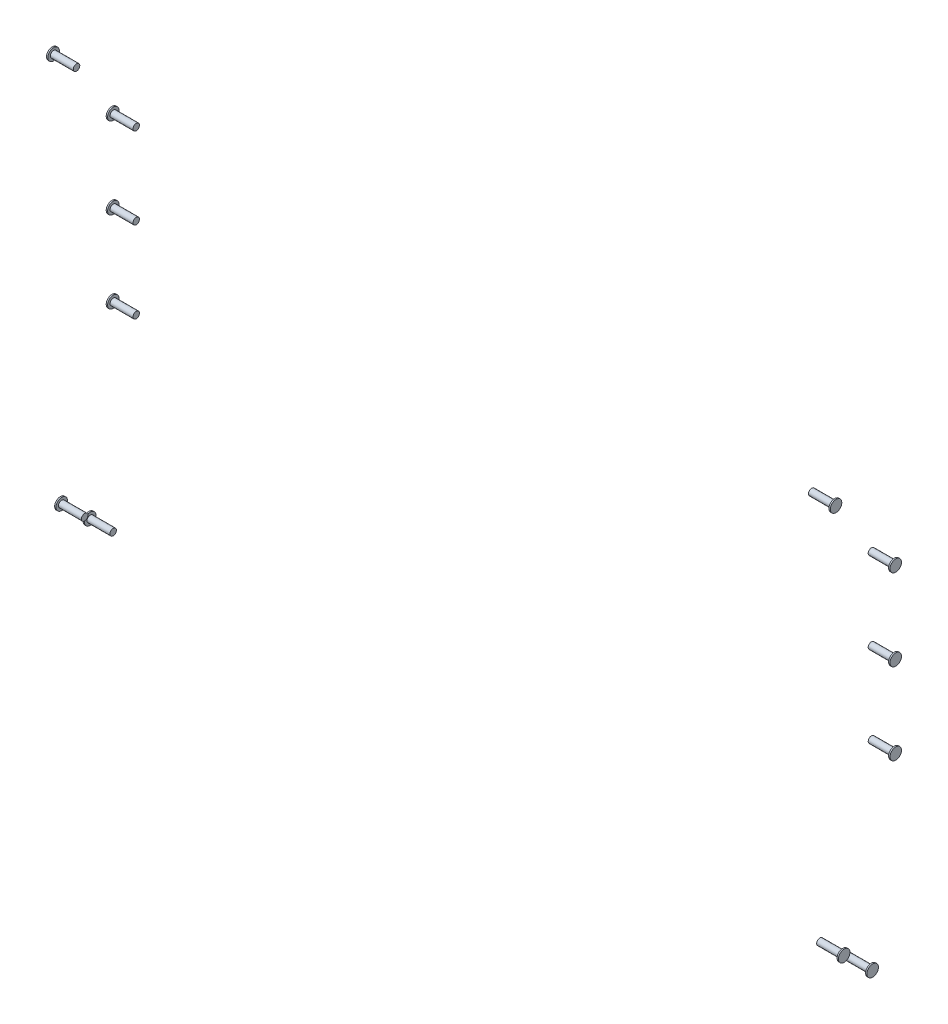
ISO-10303-21;
HEADER;
FILE_DESCRIPTION(('STEP AP214'),'2;1');
FILE_NAME('part.step','',(''),(''),'','','');
FILE_SCHEMA(('AUTOMOTIVE_DESIGN { 1 0 10303 214 1 1 1 1 }'));
ENDSEC;
DATA;
#1=APPLICATION_CONTEXT('core data for automotive mechanical design processes');
#2=APPLICATION_PROTOCOL_DEFINITION('international standard','automotive_design',2000,#1);
#3=PRODUCT_CONTEXT('',#1,'mechanical');
#4=PRODUCT('Part','Part','',(#3));
#5=PRODUCT_RELATED_PRODUCT_CATEGORY('part','',(#4));
#6=PRODUCT_DEFINITION_FORMATION('','',#4);
#7=PRODUCT_DEFINITION_CONTEXT('part definition',#1,'design');
#8=PRODUCT_DEFINITION('design','',#6,#7);
#9=PRODUCT_DEFINITION_SHAPE('','',#8);
#10=(LENGTH_UNIT() NAMED_UNIT(*) SI_UNIT(.MILLI.,.METRE.));
#11=(NAMED_UNIT(*) PLANE_ANGLE_UNIT() SI_UNIT($,.RADIAN.));
#12=(NAMED_UNIT(*) SI_UNIT($,.STERADIAN.) SOLID_ANGLE_UNIT());
#13=UNCERTAINTY_MEASURE_WITH_UNIT(LENGTH_MEASURE(1.E-05),#10,'distance_accuracy_value','');
#14=(GEOMETRIC_REPRESENTATION_CONTEXT(3) GLOBAL_UNCERTAINTY_ASSIGNED_CONTEXT((#13)) GLOBAL_UNIT_ASSIGNED_CONTEXT((#10,
#11,#12)) REPRESENTATION_CONTEXT('',''));
#15=CARTESIAN_POINT('',(0.,0.,0.));
#16=DIRECTION('',(0.,0.,1.));
#17=DIRECTION('',(1.,0.,0.));
#18=AXIS2_PLACEMENT_3D('',#15,#16,#17);
#19=CARTESIAN_POINT('',(-270.9,-190.,47.));
#20=DIRECTION('',(1.,0.,0.));
#21=DIRECTION('',(0.,0.,-1.));
#22=AXIS2_PLACEMENT_3D('',#19,#20,#21);
#23=PLANE('',#22);
#24=CARTESIAN_POINT('',(-270.9,-190.,47.));
#25=DIRECTION('',(-1.,0.,0.));
#26=DIRECTION('',(0.,0.,1.));
#27=AXIS2_PLACEMENT_3D('',#24,#25,#26);
#28=CIRCLE('',#27,2.4);
#29=CARTESIAN_POINT('',(-270.9,-190.,49.4));
#30=VERTEX_POINT('',#29);
#31=EDGE_CURVE('P0_E23',#30,#30,#28,.T.);
#32=ORIENTED_EDGE('',*,*,#31,.F.);
#33=EDGE_LOOP('',(#32));
#34=FACE_BOUND('',#33,.T.);
#35=ADVANCED_FACE('P0_F15',(#34),#23,.T.);
#36=CARTESIAN_POINT('',(-270.9,-190.,47.));
#37=DIRECTION('',(-1.,0.,0.));
#38=DIRECTION('',(0.,0.,1.));
#39=AXIS2_PLACEMENT_3D('',#36,#37,#38);
#40=CYLINDRICAL_SURFACE('',#39,2.4);
#41=CARTESIAN_POINT('',(-287.8,-190.,47.));
#42=DIRECTION('',(1.,0.,0.));
#43=DIRECTION('',(0.,0.,-1.));
#44=AXIS2_PLACEMENT_3D('',#41,#42,#43);
#45=CIRCLE('',#44,2.4);
#46=CARTESIAN_POINT('',(-287.8,-190.,44.6));
#47=VERTEX_POINT('',#46);
#48=EDGE_CURVE('P0_E10',#47,#47,#45,.F.);
#49=ORIENTED_EDGE('',*,*,#48,.F.);
#50=EDGE_LOOP('',(#49));
#51=FACE_BOUND('',#50,.T.);
#52=ORIENTED_EDGE('',*,*,#31,.T.);
#53=EDGE_LOOP('',(#52));
#54=FACE_BOUND('',#53,.T.);
#55=ADVANCED_FACE('P0_F17',(#51,#54),#40,.T.);
#56=CARTESIAN_POINT('',(-288.8,-190.,47.));
#57=DIRECTION('',(-1.,0.,0.));
#58=DIRECTION('',(0.,0.,1.));
#59=AXIS2_PLACEMENT_3D('',#56,#57,#58);
#60=PLANE('',#59);
#61=CARTESIAN_POINT('',(-288.8,-190.,47.));
#62=DIRECTION('',(1.,0.,0.));
#63=DIRECTION('',(0.,0.,-1.));
#64=AXIS2_PLACEMENT_3D('',#61,#62,#63);
#65=CIRCLE('',#64,4.25);
#66=CARTESIAN_POINT('',(-288.8,-190.,42.75));
#67=VERTEX_POINT('',#66);
#68=EDGE_CURVE('P0_E31',#67,#67,#65,.T.);
#69=ORIENTED_EDGE('',*,*,#68,.F.);
#70=EDGE_LOOP('',(#69));
#71=FACE_BOUND('',#70,.T.);
#72=ADVANCED_FACE('P0_F45',(#71),#60,.T.);
#73=CARTESIAN_POINT('',(-287.8,-190.,47.));
#74=DIRECTION('',(1.,0.,0.));
#75=DIRECTION('',(0.,0.,-1.));
#76=AXIS2_PLACEMENT_3D('',#73,#74,#75);
#77=PLANE('',#76);
#78=ORIENTED_EDGE('',*,*,#48,.T.);
#79=EDGE_LOOP('',(#78));
#80=FACE_BOUND('',#79,.T.);
#81=CARTESIAN_POINT('',(-287.8,-190.,47.));
#82=DIRECTION('',(-1.,0.,0.));
#83=DIRECTION('',(0.,0.,1.));
#84=AXIS2_PLACEMENT_3D('',#81,#82,#83);
#85=CIRCLE('',#84,4.25);
#86=CARTESIAN_POINT('',(-287.8,-190.,51.25));
#87=VERTEX_POINT('',#86);
#88=EDGE_CURVE('P0_E35',#87,#87,#85,.T.);
#89=ORIENTED_EDGE('',*,*,#88,.F.);
#90=EDGE_LOOP('',(#89));
#91=FACE_BOUND('',#90,.T.);
#92=ADVANCED_FACE('P0_F43',(#80,#91),#77,.T.);
#93=CARTESIAN_POINT('',(-287.8,-190.,47.));
#94=DIRECTION('',(-1.,0.,0.));
#95=DIRECTION('',(0.,0.,1.));
#96=AXIS2_PLACEMENT_3D('',#93,#94,#95);
#97=CYLINDRICAL_SURFACE('',#96,4.25);
#98=ORIENTED_EDGE('',*,*,#68,.T.);
#99=EDGE_LOOP('',(#98));
#100=FACE_BOUND('',#99,.T.);
#101=ORIENTED_EDGE('',*,*,#88,.T.);
#102=EDGE_LOOP('',(#101));
#103=FACE_BOUND('',#102,.T.);
#104=ADVANCED_FACE('P0_F41',(#100,#103),#97,.T.);
#105=CLOSED_SHELL('',(#35,#55,#72,#92,#104));
#106=MANIFOLD_SOLID_BREP('P0_B1',#105);
#107=CARTESIAN_POINT('',(270.9,0.,30.));
#108=DIRECTION('',(-1.,0.,0.));
#109=DIRECTION('',(0.,0.,1.));
#110=AXIS2_PLACEMENT_3D('',#107,#108,#109);
#111=PLANE('',#110);
#112=CARTESIAN_POINT('',(270.9,0.,30.));
#113=DIRECTION('',(1.,0.,0.));
#114=DIRECTION('',(0.,0.,-1.));
#115=AXIS2_PLACEMENT_3D('',#112,#113,#114);
#116=CIRCLE('',#115,2.4);
#117=CARTESIAN_POINT('',(270.9,0.,27.6));
#118=VERTEX_POINT('',#117);
#119=EDGE_CURVE('P1_E23',#118,#118,#116,.T.);
#120=ORIENTED_EDGE('',*,*,#119,.F.);
#121=EDGE_LOOP('',(#120));
#122=FACE_BOUND('',#121,.T.);
#123=ADVANCED_FACE('P1_F15',(#122),#111,.T.);
#124=CARTESIAN_POINT('',(270.9,0.,30.));
#125=DIRECTION('',(1.,0.,0.));
#126=DIRECTION('',(0.,0.,-1.));
#127=AXIS2_PLACEMENT_3D('',#124,#125,#126);
#128=CYLINDRICAL_SURFACE('',#127,2.4);
#129=CARTESIAN_POINT('',(287.8,0.,30.));
#130=DIRECTION('',(-1.,0.,0.));
#131=DIRECTION('',(0.,0.,1.));
#132=AXIS2_PLACEMENT_3D('',#129,#130,#131);
#133=CIRCLE('',#132,2.4);
#134=CARTESIAN_POINT('',(287.8,0.,32.4));
#135=VERTEX_POINT('',#134);
#136=EDGE_CURVE('P1_E10',#135,#135,#133,.F.);
#137=ORIENTED_EDGE('',*,*,#136,.F.);
#138=EDGE_LOOP('',(#137));
#139=FACE_BOUND('',#138,.T.);
#140=ORIENTED_EDGE('',*,*,#119,.T.);
#141=EDGE_LOOP('',(#140));
#142=FACE_BOUND('',#141,.T.);
#143=ADVANCED_FACE('P1_F17',(#139,#142),#128,.T.);
#144=CARTESIAN_POINT('',(288.8,0.,30.));
#145=DIRECTION('',(1.,0.,0.));
#146=DIRECTION('',(0.,0.,-1.));
#147=AXIS2_PLACEMENT_3D('',#144,#145,#146);
#148=PLANE('',#147);
#149=CARTESIAN_POINT('',(288.8,0.,30.));
#150=DIRECTION('',(-1.,0.,0.));
#151=DIRECTION('',(0.,0.,1.));
#152=AXIS2_PLACEMENT_3D('',#149,#150,#151);
#153=CIRCLE('',#152,4.25);
#154=CARTESIAN_POINT('',(288.8,0.,34.25));
#155=VERTEX_POINT('',#154);
#156=EDGE_CURVE('P1_E31',#155,#155,#153,.T.);
#157=ORIENTED_EDGE('',*,*,#156,.F.);
#158=EDGE_LOOP('',(#157));
#159=FACE_BOUND('',#158,.T.);
#160=ADVANCED_FACE('P1_F45',(#159),#148,.T.);
#161=CARTESIAN_POINT('',(287.8,0.,30.));
#162=DIRECTION('',(-1.,0.,0.));
#163=DIRECTION('',(0.,0.,1.));
#164=AXIS2_PLACEMENT_3D('',#161,#162,#163);
#165=PLANE('',#164);
#166=ORIENTED_EDGE('',*,*,#136,.T.);
#167=EDGE_LOOP('',(#166));
#168=FACE_BOUND('',#167,.T.);
#169=CARTESIAN_POINT('',(287.8,0.,30.));
#170=DIRECTION('',(1.,0.,0.));
#171=DIRECTION('',(0.,0.,-1.));
#172=AXIS2_PLACEMENT_3D('',#169,#170,#171);
#173=CIRCLE('',#172,4.25);
#174=CARTESIAN_POINT('',(287.8,0.,25.75));
#175=VERTEX_POINT('',#174);
#176=EDGE_CURVE('P1_E35',#175,#175,#173,.T.);
#177=ORIENTED_EDGE('',*,*,#176,.F.);
#178=EDGE_LOOP('',(#177));
#179=FACE_BOUND('',#178,.T.);
#180=ADVANCED_FACE('P1_F43',(#168,#179),#165,.T.);
#181=CARTESIAN_POINT('',(287.8,0.,30.));
#182=DIRECTION('',(1.,0.,0.));
#183=DIRECTION('',(0.,0.,-1.));
#184=AXIS2_PLACEMENT_3D('',#181,#182,#183);
#185=CYLINDRICAL_SURFACE('',#184,4.25);
#186=ORIENTED_EDGE('',*,*,#156,.T.);
#187=EDGE_LOOP('',(#186));
#188=FACE_BOUND('',#187,.T.);
#189=ORIENTED_EDGE('',*,*,#176,.T.);
#190=EDGE_LOOP('',(#189));
#191=FACE_BOUND('',#190,.T.);
#192=ADVANCED_FACE('P1_F41',(#188,#191),#185,.T.);
#193=CLOSED_SHELL('',(#123,#143,#160,#180,#192));
#194=MANIFOLD_SOLID_BREP('P1_B1',#193);
#195=CARTESIAN_POINT('',(270.9,60.,30.));
#196=DIRECTION('',(-1.,0.,0.));
#197=DIRECTION('',(0.,0.,1.));
#198=AXIS2_PLACEMENT_3D('',#195,#196,#197);
#199=PLANE('',#198);
#200=CARTESIAN_POINT('',(270.9,60.,30.));
#201=DIRECTION('',(1.,0.,0.));
#202=DIRECTION('',(0.,0.,-1.));
#203=AXIS2_PLACEMENT_3D('',#200,#201,#202);
#204=CIRCLE('',#203,2.4);
#205=CARTESIAN_POINT('',(270.9,60.,27.6));
#206=VERTEX_POINT('',#205);
#207=EDGE_CURVE('P2_E23',#206,#206,#204,.T.);
#208=ORIENTED_EDGE('',*,*,#207,.F.);
#209=EDGE_LOOP('',(#208));
#210=FACE_BOUND('',#209,.T.);
#211=ADVANCED_FACE('P2_F15',(#210),#199,.T.);
#212=CARTESIAN_POINT('',(270.9,60.,30.));
#213=DIRECTION('',(1.,0.,0.));
#214=DIRECTION('',(0.,0.,-1.));
#215=AXIS2_PLACEMENT_3D('',#212,#213,#214);
#216=CYLINDRICAL_SURFACE('',#215,2.4);
#217=CARTESIAN_POINT('',(287.8,60.,30.));
#218=DIRECTION('',(-1.,0.,0.));
#219=DIRECTION('',(0.,0.,1.));
#220=AXIS2_PLACEMENT_3D('',#217,#218,#219);
#221=CIRCLE('',#220,2.4);
#222=CARTESIAN_POINT('',(287.8,60.,32.4));
#223=VERTEX_POINT('',#222);
#224=EDGE_CURVE('P2_E10',#223,#223,#221,.F.);
#225=ORIENTED_EDGE('',*,*,#224,.F.);
#226=EDGE_LOOP('',(#225));
#227=FACE_BOUND('',#226,.T.);
#228=ORIENTED_EDGE('',*,*,#207,.T.);
#229=EDGE_LOOP('',(#228));
#230=FACE_BOUND('',#229,.T.);
#231=ADVANCED_FACE('P2_F17',(#227,#230),#216,.T.);
#232=CARTESIAN_POINT('',(288.8,60.,30.));
#233=DIRECTION('',(1.,0.,0.));
#234=DIRECTION('',(0.,0.,-1.));
#235=AXIS2_PLACEMENT_3D('',#232,#233,#234);
#236=PLANE('',#235);
#237=CARTESIAN_POINT('',(288.8,60.,30.));
#238=DIRECTION('',(-1.,0.,0.));
#239=DIRECTION('',(0.,0.,1.));
#240=AXIS2_PLACEMENT_3D('',#237,#238,#239);
#241=CIRCLE('',#240,4.25);
#242=CARTESIAN_POINT('',(288.8,60.,34.25));
#243=VERTEX_POINT('',#242);
#244=EDGE_CURVE('P2_E31',#243,#243,#241,.T.);
#245=ORIENTED_EDGE('',*,*,#244,.F.);
#246=EDGE_LOOP('',(#245));
#247=FACE_BOUND('',#246,.T.);
#248=ADVANCED_FACE('P2_F45',(#247),#236,.T.);
#249=CARTESIAN_POINT('',(287.8,60.,30.));
#250=DIRECTION('',(-1.,0.,0.));
#251=DIRECTION('',(0.,0.,1.));
#252=AXIS2_PLACEMENT_3D('',#249,#250,#251);
#253=PLANE('',#252);
#254=ORIENTED_EDGE('',*,*,#224,.T.);
#255=EDGE_LOOP('',(#254));
#256=FACE_BOUND('',#255,.T.);
#257=CARTESIAN_POINT('',(287.8,60.,30.));
#258=DIRECTION('',(1.,0.,0.));
#259=DIRECTION('',(0.,0.,-1.));
#260=AXIS2_PLACEMENT_3D('',#257,#258,#259);
#261=CIRCLE('',#260,4.25);
#262=CARTESIAN_POINT('',(287.8,60.,25.75));
#263=VERTEX_POINT('',#262);
#264=EDGE_CURVE('P2_E35',#263,#263,#261,.T.);
#265=ORIENTED_EDGE('',*,*,#264,.F.);
#266=EDGE_LOOP('',(#265));
#267=FACE_BOUND('',#266,.T.);
#268=ADVANCED_FACE('P2_F43',(#256,#267),#253,.T.);
#269=CARTESIAN_POINT('',(287.8,60.,30.));
#270=DIRECTION('',(1.,0.,0.));
#271=DIRECTION('',(0.,0.,-1.));
#272=AXIS2_PLACEMENT_3D('',#269,#270,#271);
#273=CYLINDRICAL_SURFACE('',#272,4.25);
#274=ORIENTED_EDGE('',*,*,#244,.T.);
#275=EDGE_LOOP('',(#274));
#276=FACE_BOUND('',#275,.T.);
#277=ORIENTED_EDGE('',*,*,#264,.T.);
#278=EDGE_LOOP('',(#277));
#279=FACE_BOUND('',#278,.T.);
#280=ADVANCED_FACE('P2_F41',(#276,#279),#273,.T.);
#281=CLOSED_SHELL('',(#211,#231,#248,#268,#280));
#282=MANIFOLD_SOLID_BREP('P2_B1',#281);
#283=CARTESIAN_POINT('',(270.9,120.,74.));
#284=DIRECTION('',(-1.,0.,0.));
#285=DIRECTION('',(0.,0.,1.));
#286=AXIS2_PLACEMENT_3D('',#283,#284,#285);
#287=PLANE('',#286);
#288=CARTESIAN_POINT('',(270.9,120.,74.));
#289=DIRECTION('',(1.,0.,0.));
#290=DIRECTION('',(0.,0.,-1.));
#291=AXIS2_PLACEMENT_3D('',#288,#289,#290);
#292=CIRCLE('',#291,2.4);
#293=CARTESIAN_POINT('',(270.9,120.,71.6));
#294=VERTEX_POINT('',#293);
#295=EDGE_CURVE('P3_E23',#294,#294,#292,.T.);
#296=ORIENTED_EDGE('',*,*,#295,.F.);
#297=EDGE_LOOP('',(#296));
#298=FACE_BOUND('',#297,.T.);
#299=ADVANCED_FACE('P3_F15',(#298),#287,.T.);
#300=CARTESIAN_POINT('',(270.9,120.,74.));
#301=DIRECTION('',(1.,0.,0.));
#302=DIRECTION('',(0.,0.,-1.));
#303=AXIS2_PLACEMENT_3D('',#300,#301,#302);
#304=CYLINDRICAL_SURFACE('',#303,2.4);
#305=CARTESIAN_POINT('',(287.8,120.,74.));
#306=DIRECTION('',(-1.,0.,0.));
#307=DIRECTION('',(0.,0.,1.));
#308=AXIS2_PLACEMENT_3D('',#305,#306,#307);
#309=CIRCLE('',#308,2.4);
#310=CARTESIAN_POINT('',(287.8,120.,76.4));
#311=VERTEX_POINT('',#310);
#312=EDGE_CURVE('P3_E10',#311,#311,#309,.F.);
#313=ORIENTED_EDGE('',*,*,#312,.F.);
#314=EDGE_LOOP('',(#313));
#315=FACE_BOUND('',#314,.T.);
#316=ORIENTED_EDGE('',*,*,#295,.T.);
#317=EDGE_LOOP('',(#316));
#318=FACE_BOUND('',#317,.T.);
#319=ADVANCED_FACE('P3_F17',(#315,#318),#304,.T.);
#320=CARTESIAN_POINT('',(288.8,120.,74.));
#321=DIRECTION('',(1.,0.,0.));
#322=DIRECTION('',(0.,0.,-1.));
#323=AXIS2_PLACEMENT_3D('',#320,#321,#322);
#324=PLANE('',#323);
#325=CARTESIAN_POINT('',(288.8,120.,74.));
#326=DIRECTION('',(-1.,0.,0.));
#327=DIRECTION('',(0.,0.,1.));
#328=AXIS2_PLACEMENT_3D('',#325,#326,#327);
#329=CIRCLE('',#328,4.25);
#330=CARTESIAN_POINT('',(288.8,120.,78.25));
#331=VERTEX_POINT('',#330);
#332=EDGE_CURVE('P3_E30',#331,#331,#329,.T.);
#333=ORIENTED_EDGE('',*,*,#332,.F.);
#334=EDGE_LOOP('',(#333));
#335=FACE_BOUND('',#334,.T.);
#336=ADVANCED_FACE('P3_F45',(#335),#324,.T.);
#337=CARTESIAN_POINT('',(287.8,120.,74.));
#338=DIRECTION('',(-1.,0.,0.));
#339=DIRECTION('',(0.,0.,1.));
#340=AXIS2_PLACEMENT_3D('',#337,#338,#339);
#341=PLANE('',#340);
#342=ORIENTED_EDGE('',*,*,#312,.T.);
#343=EDGE_LOOP('',(#342));
#344=FACE_BOUND('',#343,.T.);
#345=CARTESIAN_POINT('',(287.8,120.,74.));
#346=DIRECTION('',(1.,0.,0.));
#347=DIRECTION('',(0.,0.,-1.));
#348=AXIS2_PLACEMENT_3D('',#345,#346,#347);
#349=CIRCLE('',#348,4.25);
#350=CARTESIAN_POINT('',(287.8,120.,69.75));
#351=VERTEX_POINT('',#350);
#352=EDGE_CURVE('P3_E35',#351,#351,#349,.T.);
#353=ORIENTED_EDGE('',*,*,#352,.F.);
#354=EDGE_LOOP('',(#353));
#355=FACE_BOUND('',#354,.T.);
#356=ADVANCED_FACE('P3_F43',(#344,#355),#341,.T.);
#357=CARTESIAN_POINT('',(287.8,120.,74.));
#358=DIRECTION('',(1.,0.,0.));
#359=DIRECTION('',(0.,0.,-1.));
#360=AXIS2_PLACEMENT_3D('',#357,#358,#359);
#361=CYLINDRICAL_SURFACE('',#360,4.25);
#362=ORIENTED_EDGE('',*,*,#332,.T.);
#363=EDGE_LOOP('',(#362));
#364=FACE_BOUND('',#363,.T.);
#365=ORIENTED_EDGE('',*,*,#352,.T.);
#366=EDGE_LOOP('',(#365));
#367=FACE_BOUND('',#366,.T.);
#368=ADVANCED_FACE('P3_F41',(#364,#367),#361,.T.);
#369=CLOSED_SHELL('',(#299,#319,#336,#356,#368));
#370=MANIFOLD_SOLID_BREP('P3_B1',#369);
#371=CARTESIAN_POINT('',(-270.9,-170.,68.));
#372=DIRECTION('',(1.,0.,0.));
#373=DIRECTION('',(0.,0.,-1.));
#374=AXIS2_PLACEMENT_3D('',#371,#372,#373);
#375=PLANE('',#374);
#376=CARTESIAN_POINT('',(-270.9,-170.,68.));
#377=DIRECTION('',(-1.,0.,0.));
#378=DIRECTION('',(0.,0.,1.));
#379=AXIS2_PLACEMENT_3D('',#376,#377,#378);
#380=CIRCLE('',#379,2.4);
#381=CARTESIAN_POINT('',(-270.9,-170.,70.4));
#382=VERTEX_POINT('',#381);
#383=EDGE_CURVE('P4_E23',#382,#382,#380,.T.);
#384=ORIENTED_EDGE('',*,*,#383,.F.);
#385=EDGE_LOOP('',(#384));
#386=FACE_BOUND('',#385,.T.);
#387=ADVANCED_FACE('P4_F15',(#386),#375,.T.);
#388=CARTESIAN_POINT('',(-270.9,-170.,68.));
#389=DIRECTION('',(-1.,0.,0.));
#390=DIRECTION('',(0.,0.,1.));
#391=AXIS2_PLACEMENT_3D('',#388,#389,#390);
#392=CYLINDRICAL_SURFACE('',#391,2.4);
#393=CARTESIAN_POINT('',(-287.8,-170.,68.));
#394=DIRECTION('',(1.,0.,0.));
#395=DIRECTION('',(0.,0.,-1.));
#396=AXIS2_PLACEMENT_3D('',#393,#394,#395);
#397=CIRCLE('',#396,2.4);
#398=CARTESIAN_POINT('',(-287.8,-170.,65.6));
#399=VERTEX_POINT('',#398);
#400=EDGE_CURVE('P4_E10',#399,#399,#397,.F.);
#401=ORIENTED_EDGE('',*,*,#400,.F.);
#402=EDGE_LOOP('',(#401));
#403=FACE_BOUND('',#402,.T.);
#404=ORIENTED_EDGE('',*,*,#383,.T.);
#405=EDGE_LOOP('',(#404));
#406=FACE_BOUND('',#405,.T.);
#407=ADVANCED_FACE('P4_F17',(#403,#406),#392,.T.);
#408=CARTESIAN_POINT('',(-288.8,-170.,68.));
#409=DIRECTION('',(-1.,0.,0.));
#410=DIRECTION('',(0.,0.,1.));
#411=AXIS2_PLACEMENT_3D('',#408,#409,#410);
#412=PLANE('',#411);
#413=CARTESIAN_POINT('',(-288.8,-170.,68.));
#414=DIRECTION('',(1.,0.,0.));
#415=DIRECTION('',(0.,0.,-1.));
#416=AXIS2_PLACEMENT_3D('',#413,#414,#415);
#417=CIRCLE('',#416,4.25);
#418=CARTESIAN_POINT('',(-288.8,-170.,63.75));
#419=VERTEX_POINT('',#418);
#420=EDGE_CURVE('P4_E29',#419,#419,#417,.T.);
#421=ORIENTED_EDGE('',*,*,#420,.F.);
#422=EDGE_LOOP('',(#421));
#423=FACE_BOUND('',#422,.T.);
#424=ADVANCED_FACE('P4_F45',(#423),#412,.T.);
#425=CARTESIAN_POINT('',(-287.8,-170.,68.));
#426=DIRECTION('',(1.,0.,0.));
#427=DIRECTION('',(0.,0.,-1.));
#428=AXIS2_PLACEMENT_3D('',#425,#426,#427);
#429=PLANE('',#428);
#430=ORIENTED_EDGE('',*,*,#400,.T.);
#431=EDGE_LOOP('',(#430));
#432=FACE_BOUND('',#431,.T.);
#433=CARTESIAN_POINT('',(-287.8,-170.,68.));
#434=DIRECTION('',(-1.,0.,0.));
#435=DIRECTION('',(0.,0.,1.));
#436=AXIS2_PLACEMENT_3D('',#433,#434,#435);
#437=CIRCLE('',#436,4.25);
#438=CARTESIAN_POINT('',(-287.8,-170.,72.25));
#439=VERTEX_POINT('',#438);
#440=EDGE_CURVE('P4_E34',#439,#439,#437,.T.);
#441=ORIENTED_EDGE('',*,*,#440,.F.);
#442=EDGE_LOOP('',(#441));
#443=FACE_BOUND('',#442,.T.);
#444=ADVANCED_FACE('P4_F43',(#432,#443),#429,.T.);
#445=CARTESIAN_POINT('',(-287.8,-170.,68.));
#446=DIRECTION('',(-1.,0.,0.));
#447=DIRECTION('',(0.,0.,1.));
#448=AXIS2_PLACEMENT_3D('',#445,#446,#447);
#449=CYLINDRICAL_SURFACE('',#448,4.25);
#450=ORIENTED_EDGE('',*,*,#420,.T.);
#451=EDGE_LOOP('',(#450));
#452=FACE_BOUND('',#451,.T.);
#453=ORIENTED_EDGE('',*,*,#440,.T.);
#454=EDGE_LOOP('',(#453));
#455=FACE_BOUND('',#454,.T.);
#456=ADVANCED_FACE('P4_F41',(#452,#455),#449,.T.);
#457=CLOSED_SHELL('',(#387,#407,#424,#444,#456));
#458=MANIFOLD_SOLID_BREP('P4_B1',#457);
#459=CARTESIAN_POINT('',(-270.9,-60.,30.));
#460=DIRECTION('',(1.,0.,0.));
#461=DIRECTION('',(0.,0.,-1.));
#462=AXIS2_PLACEMENT_3D('',#459,#460,#461);
#463=PLANE('',#462);
#464=CARTESIAN_POINT('',(-270.9,-60.,30.));
#465=DIRECTION('',(-1.,0.,0.));
#466=DIRECTION('',(0.,0.,1.));
#467=AXIS2_PLACEMENT_3D('',#464,#465,#466);
#468=CIRCLE('',#467,2.4);
#469=CARTESIAN_POINT('',(-270.9,-60.,32.4));
#470=VERTEX_POINT('',#469);
#471=EDGE_CURVE('P5_E23',#470,#470,#468,.T.);
#472=ORIENTED_EDGE('',*,*,#471,.F.);
#473=EDGE_LOOP('',(#472));
#474=FACE_BOUND('',#473,.T.);
#475=ADVANCED_FACE('P5_F15',(#474),#463,.T.);
#476=CARTESIAN_POINT('',(-270.9,-60.,30.));
#477=DIRECTION('',(-1.,0.,0.));
#478=DIRECTION('',(0.,0.,1.));
#479=AXIS2_PLACEMENT_3D('',#476,#477,#478);
#480=CYLINDRICAL_SURFACE('',#479,2.4);
#481=CARTESIAN_POINT('',(-287.8,-60.,30.));
#482=DIRECTION('',(1.,0.,0.));
#483=DIRECTION('',(0.,0.,-1.));
#484=AXIS2_PLACEMENT_3D('',#481,#482,#483);
#485=CIRCLE('',#484,2.4);
#486=CARTESIAN_POINT('',(-287.8,-60.,27.6));
#487=VERTEX_POINT('',#486);
#488=EDGE_CURVE('P5_E10',#487,#487,#485,.F.);
#489=ORIENTED_EDGE('',*,*,#488,.F.);
#490=EDGE_LOOP('',(#489));
#491=FACE_BOUND('',#490,.T.);
#492=ORIENTED_EDGE('',*,*,#471,.T.);
#493=EDGE_LOOP('',(#492));
#494=FACE_BOUND('',#493,.T.);
#495=ADVANCED_FACE('P5_F17',(#491,#494),#480,.T.);
#496=CARTESIAN_POINT('',(-288.8,-60.,30.));
#497=DIRECTION('',(-1.,0.,0.));
#498=DIRECTION('',(0.,0.,1.));
#499=AXIS2_PLACEMENT_3D('',#496,#497,#498);
#500=PLANE('',#499);
#501=CARTESIAN_POINT('',(-288.8,-60.,30.));
#502=DIRECTION('',(1.,0.,0.));
#503=DIRECTION('',(0.,0.,-1.));
#504=AXIS2_PLACEMENT_3D('',#501,#502,#503);
#505=CIRCLE('',#504,4.25);
#506=CARTESIAN_POINT('',(-288.8,-60.,25.75));
#507=VERTEX_POINT('',#506);
#508=EDGE_CURVE('P5_E29',#507,#507,#505,.T.);
#509=ORIENTED_EDGE('',*,*,#508,.F.);
#510=EDGE_LOOP('',(#509));
#511=FACE_BOUND('',#510,.T.);
#512=ADVANCED_FACE('P5_F45',(#511),#500,.T.);
#513=CARTESIAN_POINT('',(-287.8,-60.,30.));
#514=DIRECTION('',(1.,0.,0.));
#515=DIRECTION('',(0.,0.,-1.));
#516=AXIS2_PLACEMENT_3D('',#513,#514,#515);
#517=PLANE('',#516);
#518=ORIENTED_EDGE('',*,*,#488,.T.);
#519=EDGE_LOOP('',(#518));
#520=FACE_BOUND('',#519,.T.);
#521=CARTESIAN_POINT('',(-287.8,-60.,30.));
#522=DIRECTION('',(-1.,0.,0.));
#523=DIRECTION('',(0.,0.,1.));
#524=AXIS2_PLACEMENT_3D('',#521,#522,#523);
#525=CIRCLE('',#524,4.25);
#526=CARTESIAN_POINT('',(-287.8,-60.,34.25));
#527=VERTEX_POINT('',#526);
#528=EDGE_CURVE('P5_E34',#527,#527,#525,.T.);
#529=ORIENTED_EDGE('',*,*,#528,.F.);
#530=EDGE_LOOP('',(#529));
#531=FACE_BOUND('',#530,.T.);
#532=ADVANCED_FACE('P5_F43',(#520,#531),#517,.T.);
#533=CARTESIAN_POINT('',(-287.8,-60.,30.));
#534=DIRECTION('',(-1.,0.,0.));
#535=DIRECTION('',(0.,0.,1.));
#536=AXIS2_PLACEMENT_3D('',#533,#534,#535);
#537=CYLINDRICAL_SURFACE('',#536,4.25);
#538=ORIENTED_EDGE('',*,*,#508,.T.);
#539=EDGE_LOOP('',(#538));
#540=FACE_BOUND('',#539,.T.);
#541=ORIENTED_EDGE('',*,*,#528,.T.);
#542=EDGE_LOOP('',(#541));
#543=FACE_BOUND('',#542,.T.);
#544=ADVANCED_FACE('P5_F41',(#540,#543),#537,.T.);
#545=CLOSED_SHELL('',(#475,#495,#512,#532,#544));
#546=MANIFOLD_SOLID_BREP('P5_B1',#545);
#547=CARTESIAN_POINT('',(-270.9,0.,30.));
#548=DIRECTION('',(1.,0.,0.));
#549=DIRECTION('',(0.,0.,-1.));
#550=AXIS2_PLACEMENT_3D('',#547,#548,#549);
#551=PLANE('',#550);
#552=CARTESIAN_POINT('',(-270.9,0.,30.));
#553=DIRECTION('',(-1.,0.,0.));
#554=DIRECTION('',(0.,0.,1.));
#555=AXIS2_PLACEMENT_3D('',#552,#553,#554);
#556=CIRCLE('',#555,2.4);
#557=CARTESIAN_POINT('',(-270.9,0.,32.4));
#558=VERTEX_POINT('',#557);
#559=EDGE_CURVE('P6_E23',#558,#558,#556,.T.);
#560=ORIENTED_EDGE('',*,*,#559,.F.);
#561=EDGE_LOOP('',(#560));
#562=FACE_BOUND('',#561,.T.);
#563=ADVANCED_FACE('P6_F15',(#562),#551,.T.);
#564=CARTESIAN_POINT('',(-270.9,0.,30.));
#565=DIRECTION('',(-1.,0.,0.));
#566=DIRECTION('',(0.,0.,1.));
#567=AXIS2_PLACEMENT_3D('',#564,#565,#566);
#568=CYLINDRICAL_SURFACE('',#567,2.4);
#569=CARTESIAN_POINT('',(-287.8,0.,30.));
#570=DIRECTION('',(1.,0.,0.));
#571=DIRECTION('',(0.,0.,-1.));
#572=AXIS2_PLACEMENT_3D('',#569,#570,#571);
#573=CIRCLE('',#572,2.4);
#574=CARTESIAN_POINT('',(-287.8,0.,27.6));
#575=VERTEX_POINT('',#574);
#576=EDGE_CURVE('P6_E10',#575,#575,#573,.F.);
#577=ORIENTED_EDGE('',*,*,#576,.F.);
#578=EDGE_LOOP('',(#577));
#579=FACE_BOUND('',#578,.T.);
#580=ORIENTED_EDGE('',*,*,#559,.T.);
#581=EDGE_LOOP('',(#580));
#582=FACE_BOUND('',#581,.T.);
#583=ADVANCED_FACE('P6_F17',(#579,#582),#568,.T.);
#584=CARTESIAN_POINT('',(-288.8,0.,30.));
#585=DIRECTION('',(-1.,0.,0.));
#586=DIRECTION('',(0.,0.,1.));
#587=AXIS2_PLACEMENT_3D('',#584,#585,#586);
#588=PLANE('',#587);
#589=CARTESIAN_POINT('',(-288.8,0.,30.));
#590=DIRECTION('',(1.,0.,0.));
#591=DIRECTION('',(0.,0.,-1.));
#592=AXIS2_PLACEMENT_3D('',#589,#590,#591);
#593=CIRCLE('',#592,4.25);
#594=CARTESIAN_POINT('',(-288.8,0.,25.75));
#595=VERTEX_POINT('',#594);
#596=EDGE_CURVE('P6_E30',#595,#595,#593,.T.);
#597=ORIENTED_EDGE('',*,*,#596,.F.);
#598=EDGE_LOOP('',(#597));
#599=FACE_BOUND('',#598,.T.);
#600=ADVANCED_FACE('P6_F45',(#599),#588,.T.);
#601=CARTESIAN_POINT('',(-287.8,0.,30.));
#602=DIRECTION('',(1.,0.,0.));
#603=DIRECTION('',(0.,0.,-1.));
#604=AXIS2_PLACEMENT_3D('',#601,#602,#603);
#605=PLANE('',#604);
#606=ORIENTED_EDGE('',*,*,#576,.T.);
#607=EDGE_LOOP('',(#606));
#608=FACE_BOUND('',#607,.T.);
#609=CARTESIAN_POINT('',(-287.8,0.,30.));
#610=DIRECTION('',(-1.,0.,0.));
#611=DIRECTION('',(0.,0.,1.));
#612=AXIS2_PLACEMENT_3D('',#609,#610,#611);
#613=CIRCLE('',#612,4.25);
#614=CARTESIAN_POINT('',(-287.8,0.,34.25));
#615=VERTEX_POINT('',#614);
#616=EDGE_CURVE('P6_E35',#615,#615,#613,.T.);
#617=ORIENTED_EDGE('',*,*,#616,.F.);
#618=EDGE_LOOP('',(#617));
#619=FACE_BOUND('',#618,.T.);
#620=ADVANCED_FACE('P6_F43',(#608,#619),#605,.T.);
#621=CARTESIAN_POINT('',(-287.8,0.,30.));
#622=DIRECTION('',(-1.,0.,0.));
#623=DIRECTION('',(0.,0.,1.));
#624=AXIS2_PLACEMENT_3D('',#621,#622,#623);
#625=CYLINDRICAL_SURFACE('',#624,4.25);
#626=ORIENTED_EDGE('',*,*,#596,.T.);
#627=EDGE_LOOP('',(#626));
#628=FACE_BOUND('',#627,.T.);
#629=ORIENTED_EDGE('',*,*,#616,.T.);
#630=EDGE_LOOP('',(#629));
#631=FACE_BOUND('',#630,.T.);
#632=ADVANCED_FACE('P6_F41',(#628,#631),#625,.T.);
#633=CLOSED_SHELL('',(#563,#583,#600,#620,#632));
#634=MANIFOLD_SOLID_BREP('P6_B1',#633);
#635=CARTESIAN_POINT('',(-270.9,60.,30.));
#636=DIRECTION('',(1.,0.,0.));
#637=DIRECTION('',(0.,0.,-1.));
#638=AXIS2_PLACEMENT_3D('',#635,#636,#637);
#639=PLANE('',#638);
#640=CARTESIAN_POINT('',(-270.9,60.,30.));
#641=DIRECTION('',(-1.,0.,0.));
#642=DIRECTION('',(0.,0.,1.));
#643=AXIS2_PLACEMENT_3D('',#640,#641,#642);
#644=CIRCLE('',#643,2.4);
#645=CARTESIAN_POINT('',(-270.9,60.,32.4));
#646=VERTEX_POINT('',#645);
#647=EDGE_CURVE('P7_E23',#646,#646,#644,.T.);
#648=ORIENTED_EDGE('',*,*,#647,.F.);
#649=EDGE_LOOP('',(#648));
#650=FACE_BOUND('',#649,.T.);
#651=ADVANCED_FACE('P7_F15',(#650),#639,.T.);
#652=CARTESIAN_POINT('',(-270.9,60.,30.));
#653=DIRECTION('',(-1.,0.,0.));
#654=DIRECTION('',(0.,0.,1.));
#655=AXIS2_PLACEMENT_3D('',#652,#653,#654);
#656=CYLINDRICAL_SURFACE('',#655,2.4);
#657=CARTESIAN_POINT('',(-287.8,60.,30.));
#658=DIRECTION('',(1.,0.,0.));
#659=DIRECTION('',(0.,0.,-1.));
#660=AXIS2_PLACEMENT_3D('',#657,#658,#659);
#661=CIRCLE('',#660,2.4);
#662=CARTESIAN_POINT('',(-287.8,60.,27.6));
#663=VERTEX_POINT('',#662);
#664=EDGE_CURVE('P7_E10',#663,#663,#661,.F.);
#665=ORIENTED_EDGE('',*,*,#664,.F.);
#666=EDGE_LOOP('',(#665));
#667=FACE_BOUND('',#666,.T.);
#668=ORIENTED_EDGE('',*,*,#647,.T.);
#669=EDGE_LOOP('',(#668));
#670=FACE_BOUND('',#669,.T.);
#671=ADVANCED_FACE('P7_F17',(#667,#670),#656,.T.);
#672=CARTESIAN_POINT('',(-288.8,60.,30.));
#673=DIRECTION('',(-1.,0.,0.));
#674=DIRECTION('',(0.,0.,1.));
#675=AXIS2_PLACEMENT_3D('',#672,#673,#674);
#676=PLANE('',#675);
#677=CARTESIAN_POINT('',(-288.8,60.,30.));
#678=DIRECTION('',(1.,0.,0.));
#679=DIRECTION('',(0.,0.,-1.));
#680=AXIS2_PLACEMENT_3D('',#677,#678,#679);
#681=CIRCLE('',#680,4.25);
#682=CARTESIAN_POINT('',(-288.8,60.,25.75));
#683=VERTEX_POINT('',#682);
#684=EDGE_CURVE('P7_E30',#683,#683,#681,.T.);
#685=ORIENTED_EDGE('',*,*,#684,.F.);
#686=EDGE_LOOP('',(#685));
#687=FACE_BOUND('',#686,.T.);
#688=ADVANCED_FACE('P7_F45',(#687),#676,.T.);
#689=CARTESIAN_POINT('',(-287.8,60.,30.));
#690=DIRECTION('',(1.,0.,0.));
#691=DIRECTION('',(0.,0.,-1.));
#692=AXIS2_PLACEMENT_3D('',#689,#690,#691);
#693=PLANE('',#692);
#694=ORIENTED_EDGE('',*,*,#664,.T.);
#695=EDGE_LOOP('',(#694));
#696=FACE_BOUND('',#695,.T.);
#697=CARTESIAN_POINT('',(-287.8,60.,30.));
#698=DIRECTION('',(-1.,0.,0.));
#699=DIRECTION('',(0.,0.,1.));
#700=AXIS2_PLACEMENT_3D('',#697,#698,#699);
#701=CIRCLE('',#700,4.25);
#702=CARTESIAN_POINT('',(-287.8,60.,34.25));
#703=VERTEX_POINT('',#702);
#704=EDGE_CURVE('P7_E35',#703,#703,#701,.T.);
#705=ORIENTED_EDGE('',*,*,#704,.F.);
#706=EDGE_LOOP('',(#705));
#707=FACE_BOUND('',#706,.T.);
#708=ADVANCED_FACE('P7_F43',(#696,#707),#693,.T.);
#709=CARTESIAN_POINT('',(-287.8,60.,30.));
#710=DIRECTION('',(-1.,0.,0.));
#711=DIRECTION('',(0.,0.,1.));
#712=AXIS2_PLACEMENT_3D('',#709,#710,#711);
#713=CYLINDRICAL_SURFACE('',#712,4.25);
#714=ORIENTED_EDGE('',*,*,#684,.T.);
#715=EDGE_LOOP('',(#714));
#716=FACE_BOUND('',#715,.T.);
#717=ORIENTED_EDGE('',*,*,#704,.T.);
#718=EDGE_LOOP('',(#717));
#719=FACE_BOUND('',#718,.T.);
#720=ADVANCED_FACE('P7_F41',(#716,#719),#713,.T.);
#721=CLOSED_SHELL('',(#651,#671,#688,#708,#720));
#722=MANIFOLD_SOLID_BREP('P7_B1',#721);
#723=CARTESIAN_POINT('',(-270.9,120.,74.));
#724=DIRECTION('',(1.,0.,0.));
#725=DIRECTION('',(0.,0.,-1.));
#726=AXIS2_PLACEMENT_3D('',#723,#724,#725);
#727=PLANE('',#726);
#728=CARTESIAN_POINT('',(-270.9,120.,74.));
#729=DIRECTION('',(-1.,0.,0.));
#730=DIRECTION('',(0.,0.,1.));
#731=AXIS2_PLACEMENT_3D('',#728,#729,#730);
#732=CIRCLE('',#731,2.4);
#733=CARTESIAN_POINT('',(-270.9,120.,76.4));
#734=VERTEX_POINT('',#733);
#735=EDGE_CURVE('P8_E23',#734,#734,#732,.T.);
#736=ORIENTED_EDGE('',*,*,#735,.F.);
#737=EDGE_LOOP('',(#736));
#738=FACE_BOUND('',#737,.T.);
#739=ADVANCED_FACE('P8_F15',(#738),#727,.T.);
#740=CARTESIAN_POINT('',(-270.9,120.,74.));
#741=DIRECTION('',(-1.,0.,0.));
#742=DIRECTION('',(0.,0.,1.));
#743=AXIS2_PLACEMENT_3D('',#740,#741,#742);
#744=CYLINDRICAL_SURFACE('',#743,2.4);
#745=CARTESIAN_POINT('',(-287.8,120.,74.));
#746=DIRECTION('',(1.,0.,0.));
#747=DIRECTION('',(0.,0.,-1.));
#748=AXIS2_PLACEMENT_3D('',#745,#746,#747);
#749=CIRCLE('',#748,2.4);
#750=CARTESIAN_POINT('',(-287.8,120.,71.6));
#751=VERTEX_POINT('',#750);
#752=EDGE_CURVE('P8_E10',#751,#751,#749,.F.);
#753=ORIENTED_EDGE('',*,*,#752,.F.);
#754=EDGE_LOOP('',(#753));
#755=FACE_BOUND('',#754,.T.);
#756=ORIENTED_EDGE('',*,*,#735,.T.);
#757=EDGE_LOOP('',(#756));
#758=FACE_BOUND('',#757,.T.);
#759=ADVANCED_FACE('P8_F17',(#755,#758),#744,.T.);
#760=CARTESIAN_POINT('',(-288.8,120.,74.));
#761=DIRECTION('',(-1.,0.,0.));
#762=DIRECTION('',(0.,0.,1.));
#763=AXIS2_PLACEMENT_3D('',#760,#761,#762);
#764=PLANE('',#763);
#765=CARTESIAN_POINT('',(-288.8,120.,74.));
#766=DIRECTION('',(1.,0.,0.));
#767=DIRECTION('',(0.,0.,-1.));
#768=AXIS2_PLACEMENT_3D('',#765,#766,#767);
#769=CIRCLE('',#768,4.25);
#770=CARTESIAN_POINT('',(-288.8,120.,69.75));
#771=VERTEX_POINT('',#770);
#772=EDGE_CURVE('P8_E30',#771,#771,#769,.T.);
#773=ORIENTED_EDGE('',*,*,#772,.F.);
#774=EDGE_LOOP('',(#773));
#775=FACE_BOUND('',#774,.T.);
#776=ADVANCED_FACE('P8_F45',(#775),#764,.T.);
#777=CARTESIAN_POINT('',(-287.8,120.,74.));
#778=DIRECTION('',(1.,0.,0.));
#779=DIRECTION('',(0.,0.,-1.));
#780=AXIS2_PLACEMENT_3D('',#777,#778,#779);
#781=PLANE('',#780);
#782=ORIENTED_EDGE('',*,*,#752,.T.);
#783=EDGE_LOOP('',(#782));
#784=FACE_BOUND('',#783,.T.);
#785=CARTESIAN_POINT('',(-287.8,120.,74.));
#786=DIRECTION('',(-1.,0.,0.));
#787=DIRECTION('',(0.,0.,1.));
#788=AXIS2_PLACEMENT_3D('',#785,#786,#787);
#789=CIRCLE('',#788,4.25);
#790=CARTESIAN_POINT('',(-287.8,120.,78.25));
#791=VERTEX_POINT('',#790);
#792=EDGE_CURVE('P8_E35',#791,#791,#789,.T.);
#793=ORIENTED_EDGE('',*,*,#792,.F.);
#794=EDGE_LOOP('',(#793));
#795=FACE_BOUND('',#794,.T.);
#796=ADVANCED_FACE('P8_F43',(#784,#795),#781,.T.);
#797=CARTESIAN_POINT('',(-287.8,120.,74.));
#798=DIRECTION('',(-1.,0.,0.));
#799=DIRECTION('',(0.,0.,1.));
#800=AXIS2_PLACEMENT_3D('',#797,#798,#799);
#801=CYLINDRICAL_SURFACE('',#800,4.25);
#802=ORIENTED_EDGE('',*,*,#772,.T.);
#803=EDGE_LOOP('',(#802));
#804=FACE_BOUND('',#803,.T.);
#805=ORIENTED_EDGE('',*,*,#792,.T.);
#806=EDGE_LOOP('',(#805));
#807=FACE_BOUND('',#806,.T.);
#808=ADVANCED_FACE('P8_F41',(#804,#807),#801,.T.);
#809=CLOSED_SHELL('',(#739,#759,#776,#796,#808));
#810=MANIFOLD_SOLID_BREP('P8_B1',#809);
#811=CARTESIAN_POINT('',(270.9,-190.,47.));
#812=DIRECTION('',(-1.,0.,0.));
#813=DIRECTION('',(0.,0.,1.));
#814=AXIS2_PLACEMENT_3D('',#811,#812,#813);
#815=PLANE('',#814);
#816=CARTESIAN_POINT('',(270.9,-190.,47.));
#817=DIRECTION('',(1.,0.,0.));
#818=DIRECTION('',(0.,0.,-1.));
#819=AXIS2_PLACEMENT_3D('',#816,#817,#818);
#820=CIRCLE('',#819,2.4);
#821=CARTESIAN_POINT('',(270.9,-190.,44.6));
#822=VERTEX_POINT('',#821);
#823=EDGE_CURVE('P9_E23',#822,#822,#820,.T.);
#824=ORIENTED_EDGE('',*,*,#823,.F.);
#825=EDGE_LOOP('',(#824));
#826=FACE_BOUND('',#825,.T.);
#827=ADVANCED_FACE('P9_F15',(#826),#815,.T.);
#828=CARTESIAN_POINT('',(270.9,-190.,47.));
#829=DIRECTION('',(1.,0.,0.));
#830=DIRECTION('',(0.,0.,-1.));
#831=AXIS2_PLACEMENT_3D('',#828,#829,#830);
#832=CYLINDRICAL_SURFACE('',#831,2.4);
#833=CARTESIAN_POINT('',(287.8,-190.,47.));
#834=DIRECTION('',(-1.,0.,0.));
#835=DIRECTION('',(0.,0.,1.));
#836=AXIS2_PLACEMENT_3D('',#833,#834,#835);
#837=CIRCLE('',#836,2.4);
#838=CARTESIAN_POINT('',(287.8,-190.,49.4));
#839=VERTEX_POINT('',#838);
#840=EDGE_CURVE('P9_E10',#839,#839,#837,.F.);
#841=ORIENTED_EDGE('',*,*,#840,.F.);
#842=EDGE_LOOP('',(#841));
#843=FACE_BOUND('',#842,.T.);
#844=ORIENTED_EDGE('',*,*,#823,.T.);
#845=EDGE_LOOP('',(#844));
#846=FACE_BOUND('',#845,.T.);
#847=ADVANCED_FACE('P9_F17',(#843,#846),#832,.T.);
#848=CARTESIAN_POINT('',(288.8,-190.,47.));
#849=DIRECTION('',(1.,0.,0.));
#850=DIRECTION('',(0.,0.,-1.));
#851=AXIS2_PLACEMENT_3D('',#848,#849,#850);
#852=PLANE('',#851);
#853=CARTESIAN_POINT('',(288.8,-190.,47.));
#854=DIRECTION('',(-1.,0.,0.));
#855=DIRECTION('',(0.,0.,1.));
#856=AXIS2_PLACEMENT_3D('',#853,#854,#855);
#857=CIRCLE('',#856,4.25);
#858=CARTESIAN_POINT('',(288.8,-190.,51.25));
#859=VERTEX_POINT('',#858);
#860=EDGE_CURVE('P9_E30',#859,#859,#857,.T.);
#861=ORIENTED_EDGE('',*,*,#860,.F.);
#862=EDGE_LOOP('',(#861));
#863=FACE_BOUND('',#862,.T.);
#864=ADVANCED_FACE('P9_F45',(#863),#852,.T.);
#865=CARTESIAN_POINT('',(287.8,-190.,47.));
#866=DIRECTION('',(-1.,0.,0.));
#867=DIRECTION('',(0.,0.,1.));
#868=AXIS2_PLACEMENT_3D('',#865,#866,#867);
#869=PLANE('',#868);
#870=ORIENTED_EDGE('',*,*,#840,.T.);
#871=EDGE_LOOP('',(#870));
#872=FACE_BOUND('',#871,.T.);
#873=CARTESIAN_POINT('',(287.8,-190.,47.));
#874=DIRECTION('',(1.,0.,0.));
#875=DIRECTION('',(0.,0.,-1.));
#876=AXIS2_PLACEMENT_3D('',#873,#874,#875);
#877=CIRCLE('',#876,4.25);
#878=CARTESIAN_POINT('',(287.8,-190.,42.75));
#879=VERTEX_POINT('',#878);
#880=EDGE_CURVE('P9_E34',#879,#879,#877,.T.);
#881=ORIENTED_EDGE('',*,*,#880,.F.);
#882=EDGE_LOOP('',(#881));
#883=FACE_BOUND('',#882,.T.);
#884=ADVANCED_FACE('P9_F43',(#872,#883),#869,.T.);
#885=CARTESIAN_POINT('',(287.8,-190.,47.));
#886=DIRECTION('',(1.,0.,0.));
#887=DIRECTION('',(0.,0.,-1.));
#888=AXIS2_PLACEMENT_3D('',#885,#886,#887);
#889=CYLINDRICAL_SURFACE('',#888,4.25);
#890=ORIENTED_EDGE('',*,*,#860,.T.);
#891=EDGE_LOOP('',(#890));
#892=FACE_BOUND('',#891,.T.);
#893=ORIENTED_EDGE('',*,*,#880,.T.);
#894=EDGE_LOOP('',(#893));
#895=FACE_BOUND('',#894,.T.);
#896=ADVANCED_FACE('P9_F41',(#892,#895),#889,.T.);
#897=CLOSED_SHELL('',(#827,#847,#864,#884,#896));
#898=MANIFOLD_SOLID_BREP('P9_B1',#897);
#899=CARTESIAN_POINT('',(270.9,-170.,68.));
#900=DIRECTION('',(-1.,0.,0.));
#901=DIRECTION('',(0.,0.,1.));
#902=AXIS2_PLACEMENT_3D('',#899,#900,#901);
#903=PLANE('',#902);
#904=CARTESIAN_POINT('',(270.9,-170.,68.));
#905=DIRECTION('',(1.,0.,0.));
#906=DIRECTION('',(0.,0.,-1.));
#907=AXIS2_PLACEMENT_3D('',#904,#905,#906);
#908=CIRCLE('',#907,2.4);
#909=CARTESIAN_POINT('',(270.9,-170.,65.6));
#910=VERTEX_POINT('',#909);
#911=EDGE_CURVE('P10_E23',#910,#910,#908,.T.);
#912=ORIENTED_EDGE('',*,*,#911,.F.);
#913=EDGE_LOOP('',(#912));
#914=FACE_BOUND('',#913,.T.);
#915=ADVANCED_FACE('P10_F15',(#914),#903,.T.);
#916=CARTESIAN_POINT('',(270.9,-170.,68.));
#917=DIRECTION('',(1.,0.,0.));
#918=DIRECTION('',(0.,0.,-1.));
#919=AXIS2_PLACEMENT_3D('',#916,#917,#918);
#920=CYLINDRICAL_SURFACE('',#919,2.4);
#921=CARTESIAN_POINT('',(287.8,-170.,68.));
#922=DIRECTION('',(-1.,0.,0.));
#923=DIRECTION('',(0.,0.,1.));
#924=AXIS2_PLACEMENT_3D('',#921,#922,#923);
#925=CIRCLE('',#924,2.4);
#926=CARTESIAN_POINT('',(287.8,-170.,70.4));
#927=VERTEX_POINT('',#926);
#928=EDGE_CURVE('P10_E10',#927,#927,#925,.F.);
#929=ORIENTED_EDGE('',*,*,#928,.F.);
#930=EDGE_LOOP('',(#929));
#931=FACE_BOUND('',#930,.T.);
#932=ORIENTED_EDGE('',*,*,#911,.T.);
#933=EDGE_LOOP('',(#932));
#934=FACE_BOUND('',#933,.T.);
#935=ADVANCED_FACE('P10_F17',(#931,#934),#920,.T.);
#936=CARTESIAN_POINT('',(288.8,-170.,68.));
#937=DIRECTION('',(1.,0.,0.));
#938=DIRECTION('',(0.,0.,-1.));
#939=AXIS2_PLACEMENT_3D('',#936,#937,#938);
#940=PLANE('',#939);
#941=CARTESIAN_POINT('',(288.8,-170.,68.));
#942=DIRECTION('',(-1.,0.,0.));
#943=DIRECTION('',(0.,0.,1.));
#944=AXIS2_PLACEMENT_3D('',#941,#942,#943);
#945=CIRCLE('',#944,4.25);
#946=CARTESIAN_POINT('',(288.8,-170.,72.25));
#947=VERTEX_POINT('',#946);
#948=EDGE_CURVE('P10_E30',#947,#947,#945,.T.);
#949=ORIENTED_EDGE('',*,*,#948,.F.);
#950=EDGE_LOOP('',(#949));
#951=FACE_BOUND('',#950,.T.);
#952=ADVANCED_FACE('P10_F45',(#951),#940,.T.);
#953=CARTESIAN_POINT('',(287.8,-170.,68.));
#954=DIRECTION('',(-1.,0.,0.));
#955=DIRECTION('',(0.,0.,1.));
#956=AXIS2_PLACEMENT_3D('',#953,#954,#955);
#957=PLANE('',#956);
#958=ORIENTED_EDGE('',*,*,#928,.T.);
#959=EDGE_LOOP('',(#958));
#960=FACE_BOUND('',#959,.T.);
#961=CARTESIAN_POINT('',(287.8,-170.,68.));
#962=DIRECTION('',(1.,0.,0.));
#963=DIRECTION('',(0.,0.,-1.));
#964=AXIS2_PLACEMENT_3D('',#961,#962,#963);
#965=CIRCLE('',#964,4.25);
#966=CARTESIAN_POINT('',(287.8,-170.,63.75));
#967=VERTEX_POINT('',#966);
#968=EDGE_CURVE('P10_E34',#967,#967,#965,.T.);
#969=ORIENTED_EDGE('',*,*,#968,.F.);
#970=EDGE_LOOP('',(#969));
#971=FACE_BOUND('',#970,.T.);
#972=ADVANCED_FACE('P10_F43',(#960,#971),#957,.T.);
#973=CARTESIAN_POINT('',(287.8,-170.,68.));
#974=DIRECTION('',(1.,0.,0.));
#975=DIRECTION('',(0.,0.,-1.));
#976=AXIS2_PLACEMENT_3D('',#973,#974,#975);
#977=CYLINDRICAL_SURFACE('',#976,4.25);
#978=ORIENTED_EDGE('',*,*,#948,.T.);
#979=EDGE_LOOP('',(#978));
#980=FACE_BOUND('',#979,.T.);
#981=ORIENTED_EDGE('',*,*,#968,.T.);
#982=EDGE_LOOP('',(#981));
#983=FACE_BOUND('',#982,.T.);
#984=ADVANCED_FACE('P10_F41',(#980,#983),#977,.T.);
#985=CLOSED_SHELL('',(#915,#935,#952,#972,#984));
#986=MANIFOLD_SOLID_BREP('P10_B1',#985);
#987=CARTESIAN_POINT('',(270.9,-60.,30.));
#988=DIRECTION('',(-1.,0.,0.));
#989=DIRECTION('',(0.,0.,1.));
#990=AXIS2_PLACEMENT_3D('',#987,#988,#989);
#991=PLANE('',#990);
#992=CARTESIAN_POINT('',(270.9,-60.,30.));
#993=DIRECTION('',(1.,0.,0.));
#994=DIRECTION('',(0.,0.,-1.));
#995=AXIS2_PLACEMENT_3D('',#992,#993,#994);
#996=CIRCLE('',#995,2.4);
#997=CARTESIAN_POINT('',(270.9,-60.,27.6));
#998=VERTEX_POINT('',#997);
#999=EDGE_CURVE('P11_E23',#998,#998,#996,.T.);
#1000=ORIENTED_EDGE('',*,*,#999,.F.);
#1001=EDGE_LOOP('',(#1000));
#1002=FACE_BOUND('',#1001,.T.);
#1003=ADVANCED_FACE('P11_F15',(#1002),#991,.T.);
#1004=CARTESIAN_POINT('',(270.9,-60.,30.));
#1005=DIRECTION('',(1.,0.,0.));
#1006=DIRECTION('',(0.,0.,-1.));
#1007=AXIS2_PLACEMENT_3D('',#1004,#1005,#1006);
#1008=CYLINDRICAL_SURFACE('',#1007,2.4);
#1009=CARTESIAN_POINT('',(287.8,-60.,30.));
#1010=DIRECTION('',(-1.,0.,0.));
#1011=DIRECTION('',(0.,0.,1.));
#1012=AXIS2_PLACEMENT_3D('',#1009,#1010,#1011);
#1013=CIRCLE('',#1012,2.4);
#1014=CARTESIAN_POINT('',(287.8,-60.,32.4));
#1015=VERTEX_POINT('',#1014);
#1016=EDGE_CURVE('P11_E10',#1015,#1015,#1013,.F.);
#1017=ORIENTED_EDGE('',*,*,#1016,.F.);
#1018=EDGE_LOOP('',(#1017));
#1019=FACE_BOUND('',#1018,.T.);
#1020=ORIENTED_EDGE('',*,*,#999,.T.);
#1021=EDGE_LOOP('',(#1020));
#1022=FACE_BOUND('',#1021,.T.);
#1023=ADVANCED_FACE('P11_F17',(#1019,#1022),#1008,.T.);
#1024=CARTESIAN_POINT('',(288.8,-60.,30.));
#1025=DIRECTION('',(1.,0.,0.));
#1026=DIRECTION('',(0.,0.,-1.));
#1027=AXIS2_PLACEMENT_3D('',#1024,#1025,#1026);
#1028=PLANE('',#1027);
#1029=CARTESIAN_POINT('',(288.8,-60.,30.));
#1030=DIRECTION('',(-1.,0.,0.));
#1031=DIRECTION('',(0.,0.,1.));
#1032=AXIS2_PLACEMENT_3D('',#1029,#1030,#1031);
#1033=CIRCLE('',#1032,4.25);
#1034=CARTESIAN_POINT('',(288.8,-60.,34.25));
#1035=VERTEX_POINT('',#1034);
#1036=EDGE_CURVE('P11_E30',#1035,#1035,#1033,.T.);
#1037=ORIENTED_EDGE('',*,*,#1036,.F.);
#1038=EDGE_LOOP('',(#1037));
#1039=FACE_BOUND('',#1038,.T.);
#1040=ADVANCED_FACE('P11_F45',(#1039),#1028,.T.);
#1041=CARTESIAN_POINT('',(287.8,-60.,30.));
#1042=DIRECTION('',(-1.,0.,0.));
#1043=DIRECTION('',(0.,0.,1.));
#1044=AXIS2_PLACEMENT_3D('',#1041,#1042,#1043);
#1045=PLANE('',#1044);
#1046=ORIENTED_EDGE('',*,*,#1016,.T.);
#1047=EDGE_LOOP('',(#1046));
#1048=FACE_BOUND('',#1047,.T.);
#1049=CARTESIAN_POINT('',(287.8,-60.,30.));
#1050=DIRECTION('',(1.,0.,0.));
#1051=DIRECTION('',(0.,0.,-1.));
#1052=AXIS2_PLACEMENT_3D('',#1049,#1050,#1051);
#1053=CIRCLE('',#1052,4.25);
#1054=CARTESIAN_POINT('',(287.8,-60.,25.75));
#1055=VERTEX_POINT('',#1054);
#1056=EDGE_CURVE('P11_E35',#1055,#1055,#1053,.T.);
#1057=ORIENTED_EDGE('',*,*,#1056,.F.);
#1058=EDGE_LOOP('',(#1057));
#1059=FACE_BOUND('',#1058,.T.);
#1060=ADVANCED_FACE('P11_F43',(#1048,#1059),#1045,.T.);
#1061=CARTESIAN_POINT('',(287.8,-60.,30.));
#1062=DIRECTION('',(1.,0.,0.));
#1063=DIRECTION('',(0.,0.,-1.));
#1064=AXIS2_PLACEMENT_3D('',#1061,#1062,#1063);
#1065=CYLINDRICAL_SURFACE('',#1064,4.25);
#1066=ORIENTED_EDGE('',*,*,#1036,.T.);
#1067=EDGE_LOOP('',(#1066));
#1068=FACE_BOUND('',#1067,.T.);
#1069=ORIENTED_EDGE('',*,*,#1056,.T.);
#1070=EDGE_LOOP('',(#1069));
#1071=FACE_BOUND('',#1070,.T.);
#1072=ADVANCED_FACE('P11_F41',(#1068,#1071),#1065,.T.);
#1073=CLOSED_SHELL('',(#1003,#1023,#1040,#1060,#1072));
#1074=MANIFOLD_SOLID_BREP('P11_B1',#1073);
#1075=ADVANCED_BREP_SHAPE_REPRESENTATION('',(#18,#106,#194,#282,#370,#458,#546,#634,#722,#810,
#898,#986,#1074),#14);
#1076=SHAPE_DEFINITION_REPRESENTATION(#9,#1075);
ENDSEC;
END-ISO-10303-21;
